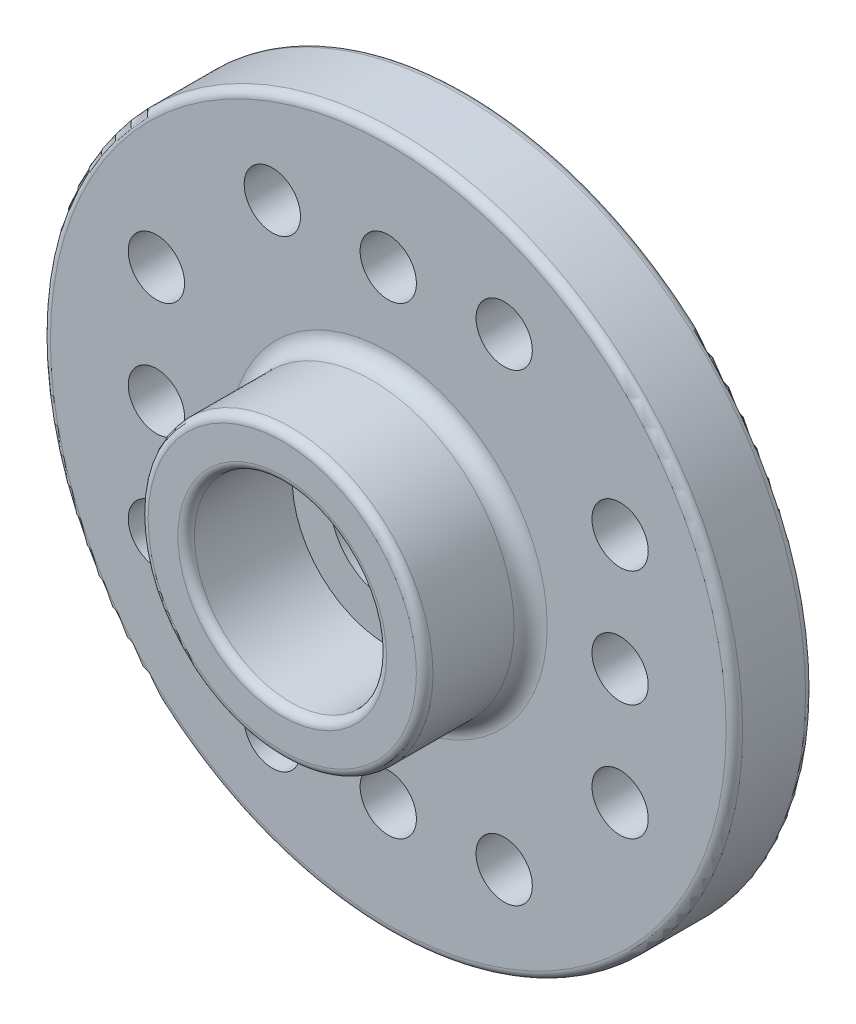
ISO-10303-21;
HEADER;
FILE_DESCRIPTION(('STEP AP214'),'2;1');
FILE_NAME('part.step','',(''),(''),'','','');
FILE_SCHEMA(('AUTOMOTIVE_DESIGN { 1 0 10303 214 1 1 1 1 }'));
ENDSEC;
DATA;
#1=APPLICATION_CONTEXT('core data for automotive mechanical design processes');
#2=APPLICATION_PROTOCOL_DEFINITION('international standard','automotive_design',2000,#1);
#3=PRODUCT_CONTEXT('',#1,'mechanical');
#4=PRODUCT('Part','Part','',(#3));
#5=PRODUCT_RELATED_PRODUCT_CATEGORY('part','',(#4));
#6=PRODUCT_DEFINITION_FORMATION('','',#4);
#7=PRODUCT_DEFINITION_CONTEXT('part definition',#1,'design');
#8=PRODUCT_DEFINITION('design','',#6,#7);
#9=PRODUCT_DEFINITION_SHAPE('','',#8);
#10=(LENGTH_UNIT() NAMED_UNIT(*) SI_UNIT(.MILLI.,.METRE.));
#11=(NAMED_UNIT(*) PLANE_ANGLE_UNIT() SI_UNIT($,.RADIAN.));
#12=(NAMED_UNIT(*) SI_UNIT($,.STERADIAN.) SOLID_ANGLE_UNIT());
#13=UNCERTAINTY_MEASURE_WITH_UNIT(LENGTH_MEASURE(1.E-05),#10,'distance_accuracy_value','');
#14=(GEOMETRIC_REPRESENTATION_CONTEXT(3) GLOBAL_UNCERTAINTY_ASSIGNED_CONTEXT((#13)) GLOBAL_UNIT_ASSIGNED_CONTEXT((#10,
#11,#12)) REPRESENTATION_CONTEXT('',''));
#15=CARTESIAN_POINT('',(0.,0.,0.));
#16=DIRECTION('',(0.,0.,1.));
#17=DIRECTION('',(1.,0.,0.));
#18=AXIS2_PLACEMENT_3D('',#15,#16,#17);
#19=CARTESIAN_POINT('',(0.,0.,2.4));
#20=DIRECTION('',(0.,0.,-1.));
#21=DIRECTION('',(-1.,0.,0.));
#22=AXIS2_PLACEMENT_3D('',#19,#20,#21);
#23=CYLINDRICAL_SURFACE('',#22,1.75);
#24=CARTESIAN_POINT('',(0.,0.,2.4));
#25=DIRECTION('',(0.,0.,1.));
#26=DIRECTION('',(1.,0.,0.));
#27=AXIS2_PLACEMENT_3D('',#24,#25,#26);
#28=CIRCLE('',#27,1.75);
#29=CARTESIAN_POINT('',(1.75,0.,2.4));
#30=VERTEX_POINT('',#29);
#31=EDGE_CURVE('E135',#30,#30,#28,.T.);
#32=ORIENTED_EDGE('',*,*,#31,.T.);
#33=EDGE_LOOP('',(#32));
#34=FACE_BOUND('',#33,.T.);
#35=CARTESIAN_POINT('',(0.,0.,0.4));
#36=DIRECTION('',(0.,0.,-1.));
#37=DIRECTION('',(-1.,0.,0.));
#38=AXIS2_PLACEMENT_3D('',#35,#36,#37);
#39=CIRCLE('',#38,1.75);
#40=CARTESIAN_POINT('',(-1.75,0.,0.4));
#41=VERTEX_POINT('',#40);
#42=EDGE_CURVE('E128',#41,#41,#39,.T.);
#43=ORIENTED_EDGE('',*,*,#42,.T.);
#44=EDGE_LOOP('',(#43));
#45=FACE_BOUND('',#44,.T.);
#46=ADVANCED_FACE('F40',(#34,#45),#23,.F.);
#47=CARTESIAN_POINT('',(0.,0.,0.));
#48=DIRECTION('',(0.,0.,1.));
#49=DIRECTION('',(1.,0.,0.));
#50=AXIS2_PLACEMENT_3D('',#47,#48,#49);
#51=PLANE('',#50);
#52=CARTESIAN_POINT('',(0.,0.,0.));
#53=DIRECTION('',(0.,0.,1.));
#54=DIRECTION('',(1.,0.,0.));
#55=AXIS2_PLACEMENT_3D('',#52,#53,#54);
#56=CIRCLE('',#55,10.2);
#57=CARTESIAN_POINT('',(10.2,0.,0.));
#58=VERTEX_POINT('',#57);
#59=EDGE_CURVE('E51',#58,#58,#56,.F.);
#60=ORIENTED_EDGE('',*,*,#59,.T.);
#61=EDGE_LOOP('',(#60));
#62=FACE_BOUND('',#61,.T.);
#63=CARTESIAN_POINT('',(-6.99999999999996,3.50000000000007,0.));
#64=DIRECTION('',(0.,0.,-1.));
#65=DIRECTION('',(0.,-1.,0.));
#66=AXIS2_PLACEMENT_3D('',#63,#64,#65);
#67=CIRCLE('',#66,0.85);
#68=CARTESIAN_POINT('',(-6.99999999999997,2.65000000000007,0.));
#69=VERTEX_POINT('',#68);
#70=EDGE_CURVE('E83',#69,#69,#67,.T.);
#71=ORIENTED_EDGE('',*,*,#70,.F.);
#72=EDGE_LOOP('',(#71));
#73=FACE_BOUND('',#72,.T.);
#74=CARTESIAN_POINT('',(-7.00000000000004,-3.49999999999993,0.));
#75=DIRECTION('',(0.,0.,-1.));
#76=DIRECTION('',(0.,-1.,0.));
#77=AXIS2_PLACEMENT_3D('',#74,#75,#76);
#78=CIRCLE('',#77,0.85);
#79=CARTESIAN_POINT('',(-7.00000000000005,-4.34999999999993,0.));
#80=VERTEX_POINT('',#79);
#81=EDGE_CURVE('E82',#80,#80,#78,.T.);
#82=ORIENTED_EDGE('',*,*,#81,.F.);
#83=EDGE_LOOP('',(#82));
#84=FACE_BOUND('',#83,.T.);
#85=CARTESIAN_POINT('',(-7.,0.,0.));
#86=DIRECTION('',(0.,0.,-1.));
#87=DIRECTION('',(0.,-1.,0.));
#88=AXIS2_PLACEMENT_3D('',#85,#86,#87);
#89=CIRCLE('',#88,0.85);
#90=CARTESIAN_POINT('',(-7.00000000000001,-0.849999999999927,0.));
#91=VERTEX_POINT('',#90);
#92=EDGE_CURVE('E87',#91,#91,#89,.T.);
#93=ORIENTED_EDGE('',*,*,#92,.F.);
#94=EDGE_LOOP('',(#93));
#95=FACE_BOUND('',#94,.T.);
#96=CARTESIAN_POINT('',(-3.5,-7.,0.));
#97=DIRECTION('',(0.,0.,-1.));
#98=DIRECTION('',(1.,0.,0.));
#99=AXIS2_PLACEMENT_3D('',#96,#97,#98);
#100=CIRCLE('',#99,0.85);
#101=CARTESIAN_POINT('',(-2.65,-7.,0.));
#102=VERTEX_POINT('',#101);
#103=EDGE_CURVE('E91',#102,#102,#100,.T.);
#104=ORIENTED_EDGE('',*,*,#103,.F.);
#105=EDGE_LOOP('',(#104));
#106=FACE_BOUND('',#105,.T.);
#107=CARTESIAN_POINT('',(3.5,-7.,0.));
#108=DIRECTION('',(0.,0.,-1.));
#109=DIRECTION('',(1.,0.,0.));
#110=AXIS2_PLACEMENT_3D('',#107,#108,#109);
#111=CIRCLE('',#110,0.85);
#112=CARTESIAN_POINT('',(4.35,-7.,0.));
#113=VERTEX_POINT('',#112);
#114=EDGE_CURVE('E95',#113,#113,#111,.T.);
#115=ORIENTED_EDGE('',*,*,#114,.F.);
#116=EDGE_LOOP('',(#115));
#117=FACE_BOUND('',#116,.T.);
#118=CARTESIAN_POINT('',(0.,-7.,0.));
#119=DIRECTION('',(0.,0.,-1.));
#120=DIRECTION('',(1.,0.,0.));
#121=AXIS2_PLACEMENT_3D('',#118,#119,#120);
#122=CIRCLE('',#121,0.85);
#123=CARTESIAN_POINT('',(0.85,-7.,0.));
#124=VERTEX_POINT('',#123);
#125=EDGE_CURVE('E99',#124,#124,#122,.T.);
#126=ORIENTED_EDGE('',*,*,#125,.F.);
#127=EDGE_LOOP('',(#126));
#128=FACE_BOUND('',#127,.T.);
#129=CARTESIAN_POINT('',(6.99999999999999,-3.50000000000002,0.));
#130=DIRECTION('',(0.,0.,-1.));
#131=DIRECTION('',(0.,1.,0.));
#132=AXIS2_PLACEMENT_3D('',#129,#130,#131);
#133=CIRCLE('',#132,0.85);
#134=CARTESIAN_POINT('',(6.99999999999999,-2.65000000000002,0.));
#135=VERTEX_POINT('',#134);
#136=EDGE_CURVE('E103',#135,#135,#133,.T.);
#137=ORIENTED_EDGE('',*,*,#136,.F.);
#138=EDGE_LOOP('',(#137));
#139=FACE_BOUND('',#138,.T.);
#140=CARTESIAN_POINT('',(7.00000000000001,3.49999999999998,0.));
#141=DIRECTION('',(0.,0.,-1.));
#142=DIRECTION('',(0.,1.,0.));
#143=AXIS2_PLACEMENT_3D('',#140,#141,#142);
#144=CIRCLE('',#143,0.85);
#145=CARTESIAN_POINT('',(7.00000000000002,4.34999999999998,0.));
#146=VERTEX_POINT('',#145);
#147=EDGE_CURVE('E107',#146,#146,#144,.T.);
#148=ORIENTED_EDGE('',*,*,#147,.F.);
#149=EDGE_LOOP('',(#148));
#150=FACE_BOUND('',#149,.T.);
#151=CARTESIAN_POINT('',(7.,0.,0.));
#152=DIRECTION('',(0.,0.,-1.));
#153=DIRECTION('',(0.,1.,0.));
#154=AXIS2_PLACEMENT_3D('',#151,#152,#153);
#155=CIRCLE('',#154,0.85);
#156=CARTESIAN_POINT('',(7.,0.849999999999975,0.));
#157=VERTEX_POINT('',#156);
#158=EDGE_CURVE('E111',#157,#157,#155,.T.);
#159=ORIENTED_EDGE('',*,*,#158,.F.);
#160=EDGE_LOOP('',(#159));
#161=FACE_BOUND('',#160,.T.);
#162=CARTESIAN_POINT('',(3.5,7.,0.));
#163=DIRECTION('',(0.,0.,-1.));
#164=DIRECTION('',(-1.,0.,0.));
#165=AXIS2_PLACEMENT_3D('',#162,#163,#164);
#166=CIRCLE('',#165,0.85);
#167=CARTESIAN_POINT('',(2.65,7.,0.));
#168=VERTEX_POINT('',#167);
#169=EDGE_CURVE('E115',#168,#168,#166,.T.);
#170=ORIENTED_EDGE('',*,*,#169,.F.);
#171=EDGE_LOOP('',(#170));
#172=FACE_BOUND('',#171,.T.);
#173=CARTESIAN_POINT('',(-3.5,7.,0.));
#174=DIRECTION('',(0.,0.,-1.));
#175=DIRECTION('',(-1.,0.,0.));
#176=AXIS2_PLACEMENT_3D('',#173,#174,#175);
#177=CIRCLE('',#176,0.85);
#178=CARTESIAN_POINT('',(-4.35,7.,0.));
#179=VERTEX_POINT('',#178);
#180=EDGE_CURVE('E119',#179,#179,#177,.T.);
#181=ORIENTED_EDGE('',*,*,#180,.F.);
#182=EDGE_LOOP('',(#181));
#183=FACE_BOUND('',#182,.T.);
#184=CARTESIAN_POINT('',(0.,7.,0.));
#185=DIRECTION('',(0.,0.,-1.));
#186=DIRECTION('',(-1.,0.,0.));
#187=AXIS2_PLACEMENT_3D('',#184,#185,#186);
#188=CIRCLE('',#187,0.85);
#189=CARTESIAN_POINT('',(-0.85,7.,0.));
#190=VERTEX_POINT('',#189);
#191=EDGE_CURVE('E123',#190,#190,#188,.T.);
#192=ORIENTED_EDGE('',*,*,#191,.F.);
#193=EDGE_LOOP('',(#192));
#194=FACE_BOUND('',#193,.T.);
#195=CARTESIAN_POINT('',(0.,0.,0.));
#196=DIRECTION('',(0.,0.,-1.));
#197=DIRECTION('',(-1.,0.,0.));
#198=AXIS2_PLACEMENT_3D('',#195,#196,#197);
#199=CIRCLE('',#198,4.);
#200=CARTESIAN_POINT('',(-4.,0.,0.));
#201=VERTEX_POINT('',#200);
#202=EDGE_CURVE('E127',#201,#201,#199,.T.);
#203=ORIENTED_EDGE('',*,*,#202,.F.);
#204=EDGE_LOOP('',(#203));
#205=FACE_BOUND('',#204,.T.);
#206=ADVANCED_FACE('F180',(#62,#73,#84,#95,#106,#117,#128,#139,#150,#161,#172,#183,#194,#205),
#51,.F.);
#207=CARTESIAN_POINT('',(0.,0.,2.4));
#208=DIRECTION('',(0.,0.,1.));
#209=DIRECTION('',(1.,0.,0.));
#210=AXIS2_PLACEMENT_3D('',#207,#208,#209);
#211=PLANE('',#210);
#212=CARTESIAN_POINT('',(0.,0.,2.4));
#213=DIRECTION('',(0.,0.,1.));
#214=DIRECTION('',(1.,0.,0.));
#215=AXIS2_PLACEMENT_3D('',#212,#213,#214);
#216=CIRCLE('',#215,4.8);
#217=CARTESIAN_POINT('',(4.8,0.,2.4));
#218=VERTEX_POINT('',#217);
#219=EDGE_CURVE('E11',#218,#218,#216,.F.);
#220=ORIENTED_EDGE('',*,*,#219,.T.);
#221=EDGE_LOOP('',(#220));
#222=FACE_BOUND('',#221,.T.);
#223=CARTESIAN_POINT('',(0.,0.,2.4));
#224=DIRECTION('',(0.,0.,1.));
#225=DIRECTION('',(1.,0.,0.));
#226=AXIS2_PLACEMENT_3D('',#223,#224,#225);
#227=CIRCLE('',#226,10.2);
#228=CARTESIAN_POINT('',(10.2,0.,2.4));
#229=VERTEX_POINT('',#228);
#230=EDGE_CURVE('E63',#229,#229,#227,.T.);
#231=ORIENTED_EDGE('',*,*,#230,.T.);
#232=EDGE_LOOP('',(#231));
#233=FACE_BOUND('',#232,.T.);
#234=CARTESIAN_POINT('',(-6.99999999999996,3.50000000000007,2.4));
#235=DIRECTION('',(0.,0.,1.));
#236=DIRECTION('',(1.,0.,0.));
#237=AXIS2_PLACEMENT_3D('',#234,#235,#236);
#238=CIRCLE('',#237,0.85);
#239=CARTESIAN_POINT('',(-6.14999999999996,3.50000000000007,2.4));
#240=VERTEX_POINT('',#239);
#241=EDGE_CURVE('E79',#240,#240,#238,.T.);
#242=ORIENTED_EDGE('',*,*,#241,.F.);
#243=EDGE_LOOP('',(#242));
#244=FACE_BOUND('',#243,.T.);
#245=CARTESIAN_POINT('',(-7.00000000000004,-3.49999999999993,2.4));
#246=DIRECTION('',(0.,0.,1.));
#247=DIRECTION('',(1.,0.,0.));
#248=AXIS2_PLACEMENT_3D('',#245,#246,#247);
#249=CIRCLE('',#248,0.85);
#250=CARTESIAN_POINT('',(-6.15000000000004,-3.49999999999993,2.4));
#251=VERTEX_POINT('',#250);
#252=EDGE_CURVE('E84',#251,#251,#249,.T.);
#253=ORIENTED_EDGE('',*,*,#252,.F.);
#254=EDGE_LOOP('',(#253));
#255=FACE_BOUND('',#254,.T.);
#256=CARTESIAN_POINT('',(-7.,0.,2.4));
#257=DIRECTION('',(0.,0.,1.));
#258=DIRECTION('',(1.,0.,0.));
#259=AXIS2_PLACEMENT_3D('',#256,#257,#258);
#260=CIRCLE('',#259,0.85);
#261=CARTESIAN_POINT('',(-6.15,0.,2.4));
#262=VERTEX_POINT('',#261);
#263=EDGE_CURVE('E88',#262,#262,#260,.T.);
#264=ORIENTED_EDGE('',*,*,#263,.F.);
#265=EDGE_LOOP('',(#264));
#266=FACE_BOUND('',#265,.T.);
#267=CARTESIAN_POINT('',(-3.5,-7.,2.4));
#268=DIRECTION('',(0.,0.,1.));
#269=DIRECTION('',(1.,0.,0.));
#270=AXIS2_PLACEMENT_3D('',#267,#268,#269);
#271=CIRCLE('',#270,0.85);
#272=CARTESIAN_POINT('',(-2.65,-7.,2.4));
#273=VERTEX_POINT('',#272);
#274=EDGE_CURVE('E92',#273,#273,#271,.T.);
#275=ORIENTED_EDGE('',*,*,#274,.F.);
#276=EDGE_LOOP('',(#275));
#277=FACE_BOUND('',#276,.T.);
#278=CARTESIAN_POINT('',(3.5,-7.,2.4));
#279=DIRECTION('',(0.,0.,1.));
#280=DIRECTION('',(1.,0.,0.));
#281=AXIS2_PLACEMENT_3D('',#278,#279,#280);
#282=CIRCLE('',#281,0.85);
#283=CARTESIAN_POINT('',(4.35,-7.,2.4));
#284=VERTEX_POINT('',#283);
#285=EDGE_CURVE('E96',#284,#284,#282,.T.);
#286=ORIENTED_EDGE('',*,*,#285,.F.);
#287=EDGE_LOOP('',(#286));
#288=FACE_BOUND('',#287,.T.);
#289=CARTESIAN_POINT('',(0.,-7.,2.4));
#290=DIRECTION('',(0.,0.,1.));
#291=DIRECTION('',(1.,0.,0.));
#292=AXIS2_PLACEMENT_3D('',#289,#290,#291);
#293=CIRCLE('',#292,0.85);
#294=CARTESIAN_POINT('',(0.85,-7.,2.4));
#295=VERTEX_POINT('',#294);
#296=EDGE_CURVE('E100',#295,#295,#293,.T.);
#297=ORIENTED_EDGE('',*,*,#296,.F.);
#298=EDGE_LOOP('',(#297));
#299=FACE_BOUND('',#298,.T.);
#300=CARTESIAN_POINT('',(6.99999999999999,-3.50000000000002,2.4));
#301=DIRECTION('',(0.,0.,1.));
#302=DIRECTION('',(1.,0.,0.));
#303=AXIS2_PLACEMENT_3D('',#300,#301,#302);
#304=CIRCLE('',#303,0.85);
#305=CARTESIAN_POINT('',(7.84999999999999,-3.50000000000002,2.4));
#306=VERTEX_POINT('',#305);
#307=EDGE_CURVE('E104',#306,#306,#304,.T.);
#308=ORIENTED_EDGE('',*,*,#307,.F.);
#309=EDGE_LOOP('',(#308));
#310=FACE_BOUND('',#309,.T.);
#311=CARTESIAN_POINT('',(7.00000000000001,3.49999999999998,2.4));
#312=DIRECTION('',(0.,0.,1.));
#313=DIRECTION('',(1.,0.,0.));
#314=AXIS2_PLACEMENT_3D('',#311,#312,#313);
#315=CIRCLE('',#314,0.85);
#316=CARTESIAN_POINT('',(7.85000000000001,3.49999999999998,2.4));
#317=VERTEX_POINT('',#316);
#318=EDGE_CURVE('E108',#317,#317,#315,.T.);
#319=ORIENTED_EDGE('',*,*,#318,.F.);
#320=EDGE_LOOP('',(#319));
#321=FACE_BOUND('',#320,.T.);
#322=CARTESIAN_POINT('',(7.,0.,2.4));
#323=DIRECTION('',(0.,0.,1.));
#324=DIRECTION('',(1.,0.,0.));
#325=AXIS2_PLACEMENT_3D('',#322,#323,#324);
#326=CIRCLE('',#325,0.85);
#327=CARTESIAN_POINT('',(7.85,0.,2.4));
#328=VERTEX_POINT('',#327);
#329=EDGE_CURVE('E112',#328,#328,#326,.T.);
#330=ORIENTED_EDGE('',*,*,#329,.F.);
#331=EDGE_LOOP('',(#330));
#332=FACE_BOUND('',#331,.T.);
#333=CARTESIAN_POINT('',(3.5,7.,2.4));
#334=DIRECTION('',(0.,0.,1.));
#335=DIRECTION('',(1.,0.,0.));
#336=AXIS2_PLACEMENT_3D('',#333,#334,#335);
#337=CIRCLE('',#336,0.85);
#338=CARTESIAN_POINT('',(4.35,7.,2.4));
#339=VERTEX_POINT('',#338);
#340=EDGE_CURVE('E116',#339,#339,#337,.T.);
#341=ORIENTED_EDGE('',*,*,#340,.F.);
#342=EDGE_LOOP('',(#341));
#343=FACE_BOUND('',#342,.T.);
#344=CARTESIAN_POINT('',(-3.5,7.,2.4));
#345=DIRECTION('',(0.,0.,1.));
#346=DIRECTION('',(1.,0.,0.));
#347=AXIS2_PLACEMENT_3D('',#344,#345,#346);
#348=CIRCLE('',#347,0.85);
#349=CARTESIAN_POINT('',(-2.65,7.,2.4));
#350=VERTEX_POINT('',#349);
#351=EDGE_CURVE('E120',#350,#350,#348,.T.);
#352=ORIENTED_EDGE('',*,*,#351,.F.);
#353=EDGE_LOOP('',(#352));
#354=FACE_BOUND('',#353,.T.);
#355=CARTESIAN_POINT('',(0.,7.,2.4));
#356=DIRECTION('',(0.,0.,1.));
#357=DIRECTION('',(1.,0.,0.));
#358=AXIS2_PLACEMENT_3D('',#355,#356,#357);
#359=CIRCLE('',#358,0.85);
#360=CARTESIAN_POINT('',(0.85,7.,2.4));
#361=VERTEX_POINT('',#360);
#362=EDGE_CURVE('E124',#361,#361,#359,.T.);
#363=ORIENTED_EDGE('',*,*,#362,.F.);
#364=EDGE_LOOP('',(#363));
#365=FACE_BOUND('',#364,.T.);
#366=ADVANCED_FACE('F183',(#222,#233,#244,#255,#266,#277,#288,#299,#310,#321,#332,#343,#354,
#365),#211,.T.);
#367=CARTESIAN_POINT('',(0.,0.,2.4));
#368=DIRECTION('',(0.,0.,1.));
#369=DIRECTION('',(1.,0.,0.));
#370=AXIS2_PLACEMENT_3D('',#367,#368,#369);
#371=CIRCLE('',#370,2.9);
#372=CARTESIAN_POINT('',(2.9,0.,2.4));
#373=VERTEX_POINT('',#372);
#374=EDGE_CURVE('E78',#373,#373,#371,.F.);
#375=ORIENTED_EDGE('',*,*,#374,.F.);
#376=EDGE_LOOP('',(#375));
#377=FACE_BOUND('',#376,.T.);
#378=ORIENTED_EDGE('',*,*,#31,.F.);
#379=EDGE_LOOP('',(#378));
#380=FACE_BOUND('',#379,.T.);
#381=ADVANCED_FACE('F237',(#377,#380),#211,.T.);
#382=CARTESIAN_POINT('',(0.,0.,2.4));
#383=DIRECTION('',(0.,0.,-1.));
#384=DIRECTION('',(-1.,0.,0.));
#385=AXIS2_PLACEMENT_3D('',#382,#383,#384);
#386=CYLINDRICAL_SURFACE('',#385,10.45);
#387=CARTESIAN_POINT('',(0.,0.,2.15));
#388=DIRECTION('',(0.,0.,1.));
#389=DIRECTION('',(1.,0.,0.));
#390=AXIS2_PLACEMENT_3D('',#387,#388,#389);
#391=CIRCLE('',#390,10.45);
#392=CARTESIAN_POINT('',(10.45,0.,2.15));
#393=VERTEX_POINT('',#392);
#394=EDGE_CURVE('E55',#393,#393,#391,.F.);
#395=ORIENTED_EDGE('',*,*,#394,.T.);
#396=EDGE_LOOP('',(#395));
#397=FACE_BOUND('',#396,.T.);
#398=CARTESIAN_POINT('',(0.,0.,0.25));
#399=DIRECTION('',(0.,0.,1.));
#400=DIRECTION('',(1.,0.,0.));
#401=AXIS2_PLACEMENT_3D('',#398,#399,#400);
#402=CIRCLE('',#401,10.45);
#403=CARTESIAN_POINT('',(10.45,0.,0.25));
#404=VERTEX_POINT('',#403);
#405=EDGE_CURVE('E60',#404,#404,#402,.T.);
#406=ORIENTED_EDGE('',*,*,#405,.T.);
#407=EDGE_LOOP('',(#406));
#408=FACE_BOUND('',#407,.T.);
#409=ADVANCED_FACE('F239',(#397,#408),#386,.T.);
#410=CARTESIAN_POINT('',(0.,0.,5.6));
#411=DIRECTION('',(0.,0.,1.));
#412=DIRECTION('',(1.,0.,0.));
#413=AXIS2_PLACEMENT_3D('',#410,#411,#412);
#414=PLANE('',#413);
#415=CARTESIAN_POINT('',(0.,0.,5.6));
#416=DIRECTION('',(0.,0.,1.));
#417=DIRECTION('',(1.,0.,0.));
#418=AXIS2_PLACEMENT_3D('',#415,#416,#417);
#419=CIRCLE('',#418,3.15);
#420=CARTESIAN_POINT('',(3.15,0.,5.6));
#421=VERTEX_POINT('',#420);
#422=EDGE_CURVE('E69',#421,#421,#419,.F.);
#423=ORIENTED_EDGE('',*,*,#422,.T.);
#424=EDGE_LOOP('',(#423));
#425=FACE_BOUND('',#424,.T.);
#426=CARTESIAN_POINT('',(0.,0.,5.6));
#427=DIRECTION('',(0.,0.,1.));
#428=DIRECTION('',(1.,0.,0.));
#429=AXIS2_PLACEMENT_3D('',#426,#427,#428);
#430=CIRCLE('',#429,4.05);
#431=CARTESIAN_POINT('',(4.05,0.,5.6));
#432=VERTEX_POINT('',#431);
#433=EDGE_CURVE('E72',#432,#432,#430,.T.);
#434=ORIENTED_EDGE('',*,*,#433,.T.);
#435=EDGE_LOOP('',(#434));
#436=FACE_BOUND('',#435,.T.);
#437=ADVANCED_FACE('F244',(#425,#436),#414,.T.);
#438=CARTESIAN_POINT('',(0.,0.,5.6));
#439=DIRECTION('',(0.,0.,-1.));
#440=DIRECTION('',(-1.,0.,0.));
#441=AXIS2_PLACEMENT_3D('',#438,#439,#440);
#442=CYLINDRICAL_SURFACE('',#441,4.3);
#443=CARTESIAN_POINT('',(0.,0.,2.9));
#444=DIRECTION('',(0.,0.,1.));
#445=DIRECTION('',(1.,0.,0.));
#446=AXIS2_PLACEMENT_3D('',#443,#444,#445);
#447=CIRCLE('',#446,4.3);
#448=CARTESIAN_POINT('',(4.3,0.,2.9));
#449=VERTEX_POINT('',#448);
#450=EDGE_CURVE('E47',#449,#449,#447,.T.);
#451=ORIENTED_EDGE('',*,*,#450,.T.);
#452=EDGE_LOOP('',(#451));
#453=FACE_BOUND('',#452,.T.);
#454=CARTESIAN_POINT('',(0.,0.,5.35));
#455=DIRECTION('',(0.,0.,1.));
#456=DIRECTION('',(1.,0.,0.));
#457=AXIS2_PLACEMENT_3D('',#454,#455,#456);
#458=CIRCLE('',#457,4.3);
#459=CARTESIAN_POINT('',(4.3,0.,5.35));
#460=VERTEX_POINT('',#459);
#461=EDGE_CURVE('E66',#460,#460,#458,.F.);
#462=ORIENTED_EDGE('',*,*,#461,.T.);
#463=EDGE_LOOP('',(#462));
#464=FACE_BOUND('',#463,.T.);
#465=ADVANCED_FACE('F235',(#453,#464),#442,.T.);
#466=CARTESIAN_POINT('',(0.,0.,5.6));
#467=DIRECTION('',(0.,0.,-1.));
#468=DIRECTION('',(-1.,0.,0.));
#469=AXIS2_PLACEMENT_3D('',#466,#467,#468);
#470=CYLINDRICAL_SURFACE('',#469,2.9);
#471=CARTESIAN_POINT('',(0.,0.,5.35));
#472=DIRECTION('',(0.,0.,1.));
#473=DIRECTION('',(1.,0.,0.));
#474=AXIS2_PLACEMENT_3D('',#471,#472,#473);
#475=CIRCLE('',#474,2.9);
#476=CARTESIAN_POINT('',(2.9,0.,5.35));
#477=VERTEX_POINT('',#476);
#478=EDGE_CURVE('E75',#477,#477,#475,.T.);
#479=ORIENTED_EDGE('',*,*,#478,.T.);
#480=EDGE_LOOP('',(#479));
#481=FACE_BOUND('',#480,.T.);
#482=ORIENTED_EDGE('',*,*,#374,.T.);
#483=EDGE_LOOP('',(#482));
#484=FACE_BOUND('',#483,.T.);
#485=ADVANCED_FACE('F281',(#481,#484),#470,.F.);
#486=CARTESIAN_POINT('',(0.,0.,-0.2));
#487=DIRECTION('',(0.,0.,-1.));
#488=DIRECTION('',(-1.,0.,0.));
#489=AXIS2_PLACEMENT_3D('',#486,#487,#488);
#490=PLANE('',#489);
#491=CARTESIAN_POINT('',(0.,0.,-0.2));
#492=DIRECTION('',(0.,0.,-1.));
#493=DIRECTION('',(-1.,0.,0.));
#494=AXIS2_PLACEMENT_3D('',#491,#492,#493);
#495=CIRCLE('',#494,3.6);
#496=CARTESIAN_POINT('',(-3.6,0.,-0.2));
#497=VERTEX_POINT('',#496);
#498=EDGE_CURVE('E138',#497,#497,#495,.T.);
#499=ORIENTED_EDGE('',*,*,#498,.T.);
#500=EDGE_LOOP('',(#499));
#501=FACE_BOUND('',#500,.T.);
#502=CARTESIAN_POINT('',(0.,0.,-0.2));
#503=DIRECTION('',(0.,0.,-1.));
#504=DIRECTION('',(-1.,0.,0.));
#505=AXIS2_PLACEMENT_3D('',#502,#503,#504);
#506=CIRCLE('',#505,3.3);
#507=CARTESIAN_POINT('',(-3.3,0.,-0.2));
#508=VERTEX_POINT('',#507);
#509=EDGE_CURVE('E131',#508,#508,#506,.T.);
#510=ORIENTED_EDGE('',*,*,#509,.F.);
#511=EDGE_LOOP('',(#510));
#512=FACE_BOUND('',#511,.T.);
#513=ADVANCED_FACE('F322',(#501,#512),#490,.T.);
#514=CARTESIAN_POINT('',(0.,0.,-0.2));
#515=DIRECTION('',(0.,0.,1.));
#516=DIRECTION('',(1.,0.,0.));
#517=AXIS2_PLACEMENT_3D('',#514,#515,#516);
#518=CYLINDRICAL_SURFACE('',#517,3.6);
#519=ORIENTED_EDGE('',*,*,#498,.F.);
#520=EDGE_LOOP('',(#519));
#521=FACE_BOUND('',#520,.T.);
#522=CARTESIAN_POINT('',(0.,0.,0.4));
#523=DIRECTION('',(0.,0.,-1.));
#524=DIRECTION('',(-1.,0.,0.));
#525=AXIS2_PLACEMENT_3D('',#522,#523,#524);
#526=CIRCLE('',#525,3.6);
#527=CARTESIAN_POINT('',(-3.6,0.,0.4));
#528=VERTEX_POINT('',#527);
#529=EDGE_CURVE('E148',#528,#528,#526,.F.);
#530=ORIENTED_EDGE('',*,*,#529,.F.);
#531=EDGE_LOOP('',(#530));
#532=FACE_BOUND('',#531,.T.);
#533=ADVANCED_FACE('F484',(#521,#532),#518,.T.);
#534=CARTESIAN_POINT('',(0.,0.,-0.2));
#535=DIRECTION('',(0.,0.,1.));
#536=DIRECTION('',(1.,0.,0.));
#537=AXIS2_PLACEMENT_3D('',#534,#535,#536);
#538=CYLINDRICAL_SURFACE('',#537,3.3);
#539=ORIENTED_EDGE('',*,*,#509,.T.);
#540=EDGE_LOOP('',(#539));
#541=FACE_BOUND('',#540,.T.);
#542=CARTESIAN_POINT('',(0.,0.,0.4));
#543=DIRECTION('',(0.,0.,-1.));
#544=DIRECTION('',(-1.,0.,0.));
#545=AXIS2_PLACEMENT_3D('',#542,#543,#544);
#546=CIRCLE('',#545,3.3);
#547=CARTESIAN_POINT('',(-3.3,0.,0.4));
#548=VERTEX_POINT('',#547);
#549=EDGE_CURVE('E132',#548,#548,#546,.T.);
#550=ORIENTED_EDGE('',*,*,#549,.F.);
#551=EDGE_LOOP('',(#550));
#552=FACE_BOUND('',#551,.T.);
#553=ADVANCED_FACE('F223',(#541,#552),#538,.F.);
#554=CARTESIAN_POINT('',(0.,0.,0.4));
#555=DIRECTION('',(0.,0.,-1.));
#556=DIRECTION('',(-1.,0.,0.));
#557=AXIS2_PLACEMENT_3D('',#554,#555,#556);
#558=PLANE('',#557);
#559=ORIENTED_EDGE('',*,*,#42,.F.);
#560=EDGE_LOOP('',(#559));
#561=FACE_BOUND('',#560,.T.);
#562=ORIENTED_EDGE('',*,*,#549,.T.);
#563=EDGE_LOOP('',(#562));
#564=FACE_BOUND('',#563,.T.);
#565=ADVANCED_FACE('F213',(#561,#564),#558,.T.);
#566=CARTESIAN_POINT('',(0.,0.,0.4));
#567=DIRECTION('',(0.,0.,-1.));
#568=DIRECTION('',(-1.,0.,0.));
#569=AXIS2_PLACEMENT_3D('',#566,#567,#568);
#570=CYLINDRICAL_SURFACE('',#569,4.);
#571=CARTESIAN_POINT('',(0.,0.,0.4));
#572=DIRECTION('',(0.,0.,-1.));
#573=DIRECTION('',(-1.,0.,0.));
#574=AXIS2_PLACEMENT_3D('',#571,#572,#573);
#575=CIRCLE('',#574,4.);
#576=CARTESIAN_POINT('',(-4.,0.,0.4));
#577=VERTEX_POINT('',#576);
#578=EDGE_CURVE('E145',#577,#577,#575,.T.);
#579=ORIENTED_EDGE('',*,*,#578,.F.);
#580=EDGE_LOOP('',(#579));
#581=FACE_BOUND('',#580,.T.);
#582=ORIENTED_EDGE('',*,*,#202,.T.);
#583=EDGE_LOOP('',(#582));
#584=FACE_BOUND('',#583,.T.);
#585=ADVANCED_FACE('F210',(#581,#584),#570,.F.);
#586=CARTESIAN_POINT('',(0.,0.,0.4));
#587=DIRECTION('',(0.,0.,-1.));
#588=DIRECTION('',(-1.,0.,0.));
#589=AXIS2_PLACEMENT_3D('',#586,#587,#588);
#590=PLANE('',#589);
#591=ORIENTED_EDGE('',*,*,#529,.T.);
#592=EDGE_LOOP('',(#591));
#593=FACE_BOUND('',#592,.T.);
#594=ORIENTED_EDGE('',*,*,#578,.T.);
#595=EDGE_LOOP('',(#594));
#596=FACE_BOUND('',#595,.T.);
#597=ADVANCED_FACE('F212',(#593,#596),#590,.T.);
#598=CARTESIAN_POINT('',(0.,7.,5.6));
#599=DIRECTION('',(0.,0.,-1.));
#600=DIRECTION('',(-1.,0.,0.));
#601=AXIS2_PLACEMENT_3D('',#598,#599,#600);
#602=CYLINDRICAL_SURFACE('',#601,0.85);
#603=ORIENTED_EDGE('',*,*,#362,.T.);
#604=EDGE_LOOP('',(#603));
#605=FACE_BOUND('',#604,.T.);
#606=ORIENTED_EDGE('',*,*,#191,.T.);
#607=EDGE_LOOP('',(#606));
#608=FACE_BOUND('',#607,.T.);
#609=ADVANCED_FACE('F220',(#605,#608),#602,.F.);
#610=CARTESIAN_POINT('',(-3.5,7.,5.6));
#611=DIRECTION('',(0.,0.,-1.));
#612=DIRECTION('',(-1.,0.,0.));
#613=AXIS2_PLACEMENT_3D('',#610,#611,#612);
#614=CYLINDRICAL_SURFACE('',#613,0.85);
#615=ORIENTED_EDGE('',*,*,#351,.T.);
#616=EDGE_LOOP('',(#615));
#617=FACE_BOUND('',#616,.T.);
#618=ORIENTED_EDGE('',*,*,#180,.T.);
#619=EDGE_LOOP('',(#618));
#620=FACE_BOUND('',#619,.T.);
#621=ADVANCED_FACE('F440',(#617,#620),#614,.F.);
#622=CARTESIAN_POINT('',(3.5,7.,5.6));
#623=DIRECTION('',(0.,0.,-1.));
#624=DIRECTION('',(-1.,0.,0.));
#625=AXIS2_PLACEMENT_3D('',#622,#623,#624);
#626=CYLINDRICAL_SURFACE('',#625,0.85);
#627=ORIENTED_EDGE('',*,*,#340,.T.);
#628=EDGE_LOOP('',(#627));
#629=FACE_BOUND('',#628,.T.);
#630=ORIENTED_EDGE('',*,*,#169,.T.);
#631=EDGE_LOOP('',(#630));
#632=FACE_BOUND('',#631,.T.);
#633=ADVANCED_FACE('F430',(#629,#632),#626,.F.);
#634=CARTESIAN_POINT('',(7.,0.,5.6));
#635=DIRECTION('',(0.,0.,-1.));
#636=DIRECTION('',(-1.,0.,0.));
#637=AXIS2_PLACEMENT_3D('',#634,#635,#636);
#638=CYLINDRICAL_SURFACE('',#637,0.85);
#639=ORIENTED_EDGE('',*,*,#329,.T.);
#640=EDGE_LOOP('',(#639));
#641=FACE_BOUND('',#640,.T.);
#642=ORIENTED_EDGE('',*,*,#158,.T.);
#643=EDGE_LOOP('',(#642));
#644=FACE_BOUND('',#643,.T.);
#645=ADVANCED_FACE('F420',(#641,#644),#638,.F.);
#646=CARTESIAN_POINT('',(7.00000000000001,3.49999999999998,5.6));
#647=DIRECTION('',(0.,0.,-1.));
#648=DIRECTION('',(-1.,0.,0.));
#649=AXIS2_PLACEMENT_3D('',#646,#647,#648);
#650=CYLINDRICAL_SURFACE('',#649,0.85);
#651=ORIENTED_EDGE('',*,*,#318,.T.);
#652=EDGE_LOOP('',(#651));
#653=FACE_BOUND('',#652,.T.);
#654=ORIENTED_EDGE('',*,*,#147,.T.);
#655=EDGE_LOOP('',(#654));
#656=FACE_BOUND('',#655,.T.);
#657=ADVANCED_FACE('F410',(#653,#656),#650,.F.);
#658=CARTESIAN_POINT('',(6.99999999999999,-3.50000000000002,5.6));
#659=DIRECTION('',(0.,0.,-1.));
#660=DIRECTION('',(-1.,0.,0.));
#661=AXIS2_PLACEMENT_3D('',#658,#659,#660);
#662=CYLINDRICAL_SURFACE('',#661,0.85);
#663=ORIENTED_EDGE('',*,*,#307,.T.);
#664=EDGE_LOOP('',(#663));
#665=FACE_BOUND('',#664,.T.);
#666=ORIENTED_EDGE('',*,*,#136,.T.);
#667=EDGE_LOOP('',(#666));
#668=FACE_BOUND('',#667,.T.);
#669=ADVANCED_FACE('F400',(#665,#668),#662,.F.);
#670=CARTESIAN_POINT('',(0.,-7.,5.6));
#671=DIRECTION('',(0.,0.,-1.));
#672=DIRECTION('',(-1.,0.,0.));
#673=AXIS2_PLACEMENT_3D('',#670,#671,#672);
#674=CYLINDRICAL_SURFACE('',#673,0.85);
#675=ORIENTED_EDGE('',*,*,#296,.T.);
#676=EDGE_LOOP('',(#675));
#677=FACE_BOUND('',#676,.T.);
#678=ORIENTED_EDGE('',*,*,#125,.T.);
#679=EDGE_LOOP('',(#678));
#680=FACE_BOUND('',#679,.T.);
#681=ADVANCED_FACE('F390',(#677,#680),#674,.F.);
#682=CARTESIAN_POINT('',(3.5,-7.,5.6));
#683=DIRECTION('',(0.,0.,-1.));
#684=DIRECTION('',(-1.,0.,0.));
#685=AXIS2_PLACEMENT_3D('',#682,#683,#684);
#686=CYLINDRICAL_SURFACE('',#685,0.85);
#687=ORIENTED_EDGE('',*,*,#285,.T.);
#688=EDGE_LOOP('',(#687));
#689=FACE_BOUND('',#688,.T.);
#690=ORIENTED_EDGE('',*,*,#114,.T.);
#691=EDGE_LOOP('',(#690));
#692=FACE_BOUND('',#691,.T.);
#693=ADVANCED_FACE('F380',(#689,#692),#686,.F.);
#694=CARTESIAN_POINT('',(-3.5,-7.,5.6));
#695=DIRECTION('',(0.,0.,-1.));
#696=DIRECTION('',(-1.,0.,0.));
#697=AXIS2_PLACEMENT_3D('',#694,#695,#696);
#698=CYLINDRICAL_SURFACE('',#697,0.85);
#699=ORIENTED_EDGE('',*,*,#274,.T.);
#700=EDGE_LOOP('',(#699));
#701=FACE_BOUND('',#700,.T.);
#702=ORIENTED_EDGE('',*,*,#103,.T.);
#703=EDGE_LOOP('',(#702));
#704=FACE_BOUND('',#703,.T.);
#705=ADVANCED_FACE('F370',(#701,#704),#698,.F.);
#706=CARTESIAN_POINT('',(-7.,0.,5.6));
#707=DIRECTION('',(0.,0.,-1.));
#708=DIRECTION('',(-1.,0.,0.));
#709=AXIS2_PLACEMENT_3D('',#706,#707,#708);
#710=CYLINDRICAL_SURFACE('',#709,0.85);
#711=ORIENTED_EDGE('',*,*,#263,.T.);
#712=EDGE_LOOP('',(#711));
#713=FACE_BOUND('',#712,.T.);
#714=ORIENTED_EDGE('',*,*,#92,.T.);
#715=EDGE_LOOP('',(#714));
#716=FACE_BOUND('',#715,.T.);
#717=ADVANCED_FACE('F360',(#713,#716),#710,.F.);
#718=CARTESIAN_POINT('',(-7.00000000000004,-3.49999999999993,5.6));
#719=DIRECTION('',(0.,0.,-1.));
#720=DIRECTION('',(-1.,0.,0.));
#721=AXIS2_PLACEMENT_3D('',#718,#719,#720);
#722=CYLINDRICAL_SURFACE('',#721,0.85);
#723=ORIENTED_EDGE('',*,*,#252,.T.);
#724=EDGE_LOOP('',(#723));
#725=FACE_BOUND('',#724,.T.);
#726=ORIENTED_EDGE('',*,*,#81,.T.);
#727=EDGE_LOOP('',(#726));
#728=FACE_BOUND('',#727,.T.);
#729=ADVANCED_FACE('F350',(#725,#728),#722,.F.);
#730=CARTESIAN_POINT('',(-6.99999999999996,3.50000000000007,5.6));
#731=DIRECTION('',(0.,0.,-1.));
#732=DIRECTION('',(-1.,0.,0.));
#733=AXIS2_PLACEMENT_3D('',#730,#731,#732);
#734=CYLINDRICAL_SURFACE('',#733,0.85);
#735=ORIENTED_EDGE('',*,*,#241,.T.);
#736=EDGE_LOOP('',(#735));
#737=FACE_BOUND('',#736,.T.);
#738=ORIENTED_EDGE('',*,*,#70,.T.);
#739=EDGE_LOOP('',(#738));
#740=FACE_BOUND('',#739,.T.);
#741=ADVANCED_FACE('F178',(#737,#740),#734,.F.);
#742=CARTESIAN_POINT('',(0.,0.,5.35));
#743=DIRECTION('',(0.,0.,1.));
#744=DIRECTION('',(1.,0.,0.));
#745=AXIS2_PLACEMENT_3D('',#742,#743,#744);
#746=TOROIDAL_SURFACE('',#745,3.15,0.25);
#747=ORIENTED_EDGE('',*,*,#422,.F.);
#748=EDGE_LOOP('',(#747));
#749=FACE_BOUND('',#748,.T.);
#750=ORIENTED_EDGE('',*,*,#478,.F.);
#751=EDGE_LOOP('',(#750));
#752=FACE_BOUND('',#751,.T.);
#753=ADVANCED_FACE('F246',(#749,#752),#746,.T.);
#754=CARTESIAN_POINT('',(0.,0.,5.35));
#755=DIRECTION('',(0.,0.,1.));
#756=DIRECTION('',(1.,0.,0.));
#757=AXIS2_PLACEMENT_3D('',#754,#755,#756);
#758=TOROIDAL_SURFACE('',#757,4.05,0.25);
#759=ORIENTED_EDGE('',*,*,#461,.F.);
#760=EDGE_LOOP('',(#759));
#761=FACE_BOUND('',#760,.T.);
#762=ORIENTED_EDGE('',*,*,#433,.F.);
#763=EDGE_LOOP('',(#762));
#764=FACE_BOUND('',#763,.T.);
#765=ADVANCED_FACE('F249',(#761,#764),#758,.T.);
#766=CARTESIAN_POINT('',(0.,0.,2.15));
#767=DIRECTION('',(0.,0.,1.));
#768=DIRECTION('',(1.,0.,0.));
#769=AXIS2_PLACEMENT_3D('',#766,#767,#768);
#770=TOROIDAL_SURFACE('',#769,10.2,0.25);
#771=ORIENTED_EDGE('',*,*,#394,.F.);
#772=EDGE_LOOP('',(#771));
#773=FACE_BOUND('',#772,.T.);
#774=ORIENTED_EDGE('',*,*,#230,.F.);
#775=EDGE_LOOP('',(#774));
#776=FACE_BOUND('',#775,.T.);
#777=ADVANCED_FACE('F253',(#773,#776),#770,.T.);
#778=CARTESIAN_POINT('',(0.,0.,0.25));
#779=DIRECTION('',(0.,0.,1.));
#780=DIRECTION('',(1.,0.,0.));
#781=AXIS2_PLACEMENT_3D('',#778,#779,#780);
#782=TOROIDAL_SURFACE('',#781,10.2,0.25);
#783=ORIENTED_EDGE('',*,*,#59,.F.);
#784=EDGE_LOOP('',(#783));
#785=FACE_BOUND('',#784,.T.);
#786=ORIENTED_EDGE('',*,*,#405,.F.);
#787=EDGE_LOOP('',(#786));
#788=FACE_BOUND('',#787,.T.);
#789=ADVANCED_FACE('F256',(#785,#788),#782,.T.);
#790=CARTESIAN_POINT('',(0.,0.,2.9));
#791=DIRECTION('',(0.,0.,1.));
#792=DIRECTION('',(1.,0.,0.));
#793=AXIS2_PLACEMENT_3D('',#790,#791,#792);
#794=TOROIDAL_SURFACE('',#793,4.8,0.5);
#795=ORIENTED_EDGE('',*,*,#219,.F.);
#796=EDGE_LOOP('',(#795));
#797=FACE_BOUND('',#796,.T.);
#798=ORIENTED_EDGE('',*,*,#450,.F.);
#799=EDGE_LOOP('',(#798));
#800=FACE_BOUND('',#799,.T.);
#801=ADVANCED_FACE('F42',(#797,#800),#794,.F.);
#802=CLOSED_SHELL('',(#46,#206,#366,#381,#409,#437,#465,#485,#513,#533,#553,#565,#585,#597,#609,
#621,#633,#645,#657,#669,#681,#693,#705,#717,#729,#741,#753,#765,#777,#789,#801));
#803=MANIFOLD_SOLID_BREP('B2',#802);
#804=ADVANCED_BREP_SHAPE_REPRESENTATION('',(#18,#803),#14);
#805=SHAPE_DEFINITION_REPRESENTATION(#9,#804);
ENDSEC;
END-ISO-10303-21;
